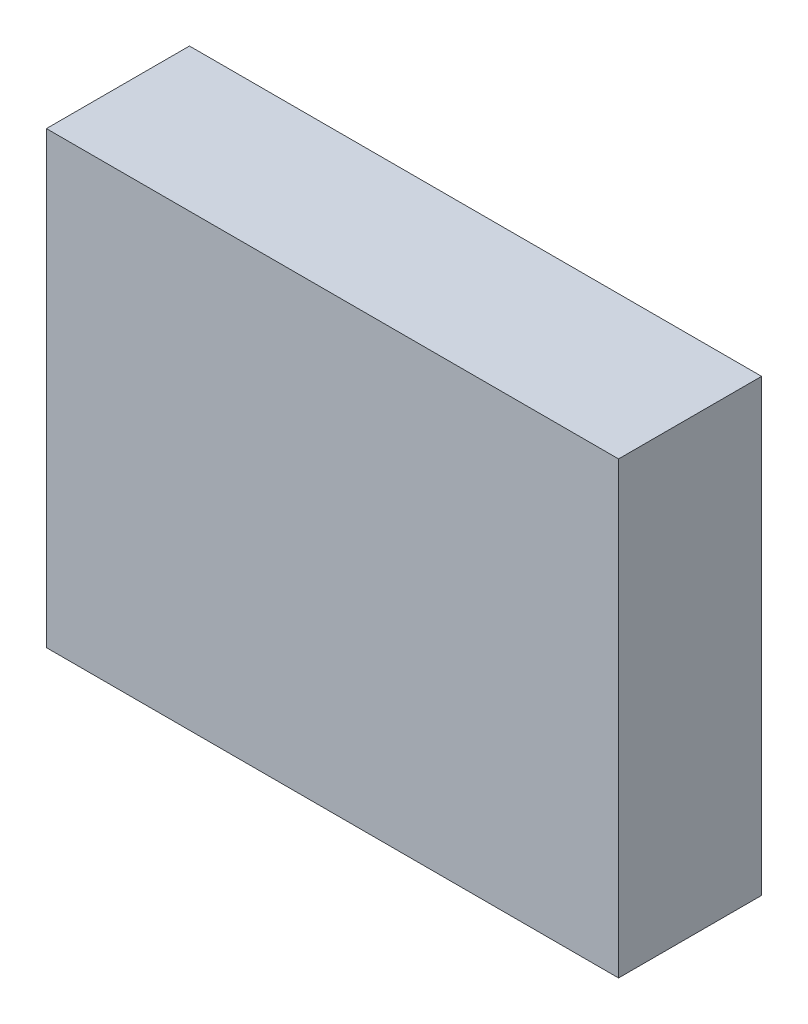
ISO-10303-21;
HEADER;
FILE_DESCRIPTION(('STEP AP214'),'2;1');
FILE_NAME('part.step','',(''),(''),'','','');
FILE_SCHEMA(('AUTOMOTIVE_DESIGN { 1 0 10303 214 1 1 1 1 }'));
ENDSEC;
DATA;
#1=APPLICATION_CONTEXT('core data for automotive mechanical design processes');
#2=APPLICATION_PROTOCOL_DEFINITION('international standard','automotive_design',2000,#1);
#3=PRODUCT_CONTEXT('',#1,'mechanical');
#4=PRODUCT('Part','Part','',(#3));
#5=PRODUCT_RELATED_PRODUCT_CATEGORY('part','',(#4));
#6=PRODUCT_DEFINITION_FORMATION('','',#4);
#7=PRODUCT_DEFINITION_CONTEXT('part definition',#1,'design');
#8=PRODUCT_DEFINITION('design','',#6,#7);
#9=PRODUCT_DEFINITION_SHAPE('','',#8);
#10=(LENGTH_UNIT() NAMED_UNIT(*) SI_UNIT(.MILLI.,.METRE.));
#11=(NAMED_UNIT(*) PLANE_ANGLE_UNIT() SI_UNIT($,.RADIAN.));
#12=(NAMED_UNIT(*) SI_UNIT($,.STERADIAN.) SOLID_ANGLE_UNIT());
#13=UNCERTAINTY_MEASURE_WITH_UNIT(LENGTH_MEASURE(1.E-05),#10,'distance_accuracy_value','');
#14=(GEOMETRIC_REPRESENTATION_CONTEXT(3) GLOBAL_UNCERTAINTY_ASSIGNED_CONTEXT((#13)) GLOBAL_UNIT_ASSIGNED_CONTEXT((#10,
#11,#12)) REPRESENTATION_CONTEXT('',''));
#15=CARTESIAN_POINT('',(0.,0.,0.));
#16=DIRECTION('',(0.,0.,1.));
#17=DIRECTION('',(1.,0.,0.));
#18=AXIS2_PLACEMENT_3D('',#15,#16,#17);
#19=CARTESIAN_POINT('',(0.,-6.,16.));
#20=DIRECTION('',(0.,0.,1.));
#21=DIRECTION('',(1.,0.,0.));
#22=AXIS2_PLACEMENT_3D('',#19,#20,#21);
#23=PLANE('',#22);
#24=DIRECTION('',(1.,0.,0.));
#25=VECTOR('',#24,1.);
#26=CARTESIAN_POINT('',(-7.,-11.5,16.));
#27=LINE('',#26,#25);
#28=CARTESIAN_POINT('',(-7.,-11.5,16.));
#29=VERTEX_POINT('',#28);
#30=CARTESIAN_POINT('',(7.,-11.5,16.));
#31=VERTEX_POINT('',#30);
#32=EDGE_CURVE('E79',#29,#31,#27,.T.);
#33=ORIENTED_EDGE('',*,*,#32,.T.);
#34=DIRECTION('',(0.,1.,0.));
#35=VECTOR('',#34,1.);
#36=CARTESIAN_POINT('',(7.,-11.5,16.));
#37=LINE('',#36,#35);
#38=CARTESIAN_POINT('',(7.,-0.5,16.));
#39=VERTEX_POINT('',#38);
#40=EDGE_CURVE('E96',#31,#39,#37,.T.);
#41=ORIENTED_EDGE('',*,*,#40,.T.);
#42=DIRECTION('',(-1.,0.,0.));
#43=VECTOR('',#42,1.);
#44=CARTESIAN_POINT('',(7.,-0.5,16.));
#45=LINE('',#44,#43);
#46=CARTESIAN_POINT('',(-7.,-0.5,16.));
#47=VERTEX_POINT('',#46);
#48=EDGE_CURVE('E73',#39,#47,#45,.T.);
#49=ORIENTED_EDGE('',*,*,#48,.T.);
#50=DIRECTION('',(0.,-1.,0.));
#51=VECTOR('',#50,1.);
#52=CARTESIAN_POINT('',(-7.,-0.5,16.));
#53=LINE('',#52,#51);
#54=EDGE_CURVE('E9',#47,#29,#53,.T.);
#55=ORIENTED_EDGE('',*,*,#54,.T.);
#56=EDGE_LOOP('',(#33,#41,#49,#55));
#57=FACE_BOUND('',#56,.T.);
#58=ADVANCED_FACE('F15',(#57),#23,.T.);
#59=CARTESIAN_POINT('',(0.,-6.,12.5));
#60=DIRECTION('',(0.,0.,1.));
#61=DIRECTION('',(1.,0.,0.));
#62=AXIS2_PLACEMENT_3D('',#59,#60,#61);
#63=PLANE('',#62);
#64=DIRECTION('',(0.,-1.,0.));
#65=VECTOR('',#64,1.);
#66=CARTESIAN_POINT('',(-7.,-0.5,12.5));
#67=LINE('',#66,#65);
#68=CARTESIAN_POINT('',(-7.,-0.5,12.5));
#69=VERTEX_POINT('',#68);
#70=CARTESIAN_POINT('',(-7.,-11.5,12.5));
#71=VERTEX_POINT('',#70);
#72=EDGE_CURVE('E18',#69,#71,#67,.T.);
#73=ORIENTED_EDGE('',*,*,#72,.F.);
#74=DIRECTION('',(-1.,0.,0.));
#75=VECTOR('',#74,1.);
#76=CARTESIAN_POINT('',(7.,-0.5,12.5));
#77=LINE('',#76,#75);
#78=CARTESIAN_POINT('',(7.,-0.5,12.5));
#79=VERTEX_POINT('',#78);
#80=EDGE_CURVE('E99',#79,#69,#77,.T.);
#81=ORIENTED_EDGE('',*,*,#80,.F.);
#82=DIRECTION('',(0.,1.,0.));
#83=VECTOR('',#82,1.);
#84=CARTESIAN_POINT('',(7.,-11.5,12.5));
#85=LINE('',#84,#83);
#86=CARTESIAN_POINT('',(7.,-11.5,12.5));
#87=VERTEX_POINT('',#86);
#88=EDGE_CURVE('E85',#87,#79,#85,.T.);
#89=ORIENTED_EDGE('',*,*,#88,.F.);
#90=DIRECTION('',(1.,0.,0.));
#91=VECTOR('',#90,1.);
#92=CARTESIAN_POINT('',(-7.,-11.5,12.5));
#93=LINE('',#92,#91);
#94=EDGE_CURVE('E77',#71,#87,#93,.T.);
#95=ORIENTED_EDGE('',*,*,#94,.F.);
#96=EDGE_LOOP('',(#73,#81,#89,#95));
#97=FACE_BOUND('',#96,.T.);
#98=ADVANCED_FACE('F82',(#97),#63,.F.);
#99=CARTESIAN_POINT('',(-7.,-0.5,12.5));
#100=DIRECTION('',(1.,0.,0.));
#101=DIRECTION('',(0.,1.,0.));
#102=AXIS2_PLACEMENT_3D('',#99,#100,#101);
#103=PLANE('',#102);
#104=ORIENTED_EDGE('',*,*,#72,.T.);
#105=DIRECTION('',(0.,0.,1.));
#106=VECTOR('',#105,1.);
#107=CARTESIAN_POINT('',(-7.,-11.5,12.5));
#108=LINE('',#107,#106);
#109=EDGE_CURVE('E70',#71,#29,#108,.T.);
#110=ORIENTED_EDGE('',*,*,#109,.T.);
#111=ORIENTED_EDGE('',*,*,#54,.F.);
#112=DIRECTION('',(0.,0.,1.));
#113=VECTOR('',#112,1.);
#114=CARTESIAN_POINT('',(-7.,-0.5,12.5));
#115=LINE('',#114,#113);
#116=EDGE_CURVE('E69',#69,#47,#115,.T.);
#117=ORIENTED_EDGE('',*,*,#116,.F.);
#118=EDGE_LOOP('',(#104,#110,#111,#117));
#119=FACE_BOUND('',#118,.T.);
#120=ADVANCED_FACE('F66',(#119),#103,.F.);
#121=CARTESIAN_POINT('',(7.,-0.5,12.5));
#122=DIRECTION('',(0.,-1.,0.));
#123=DIRECTION('',(0.,0.,-1.));
#124=AXIS2_PLACEMENT_3D('',#121,#122,#123);
#125=PLANE('',#124);
#126=ORIENTED_EDGE('',*,*,#80,.T.);
#127=ORIENTED_EDGE('',*,*,#116,.T.);
#128=ORIENTED_EDGE('',*,*,#48,.F.);
#129=DIRECTION('',(0.,0.,1.));
#130=VECTOR('',#129,1.);
#131=CARTESIAN_POINT('',(7.,-0.5,12.5));
#132=LINE('',#131,#130);
#133=EDGE_CURVE('E101',#79,#39,#132,.T.);
#134=ORIENTED_EDGE('',*,*,#133,.F.);
#135=EDGE_LOOP('',(#126,#127,#128,#134));
#136=FACE_BOUND('',#135,.T.);
#137=ADVANCED_FACE('F113',(#136),#125,.F.);
#138=CARTESIAN_POINT('',(7.,-11.5,12.5));
#139=DIRECTION('',(-1.,0.,0.));
#140=DIRECTION('',(0.,0.,1.));
#141=AXIS2_PLACEMENT_3D('',#138,#139,#140);
#142=PLANE('',#141);
#143=ORIENTED_EDGE('',*,*,#88,.T.);
#144=ORIENTED_EDGE('',*,*,#133,.T.);
#145=ORIENTED_EDGE('',*,*,#40,.F.);
#146=DIRECTION('',(0.,0.,1.));
#147=VECTOR('',#146,1.);
#148=CARTESIAN_POINT('',(7.,-11.5,12.5));
#149=LINE('',#148,#147);
#150=EDGE_CURVE('E86',#87,#31,#149,.T.);
#151=ORIENTED_EDGE('',*,*,#150,.F.);
#152=EDGE_LOOP('',(#143,#144,#145,#151));
#153=FACE_BOUND('',#152,.T.);
#154=ADVANCED_FACE('F117',(#153),#142,.F.);
#155=CARTESIAN_POINT('',(-7.,-11.5,12.5));
#156=DIRECTION('',(0.,1.,0.));
#157=DIRECTION('',(1.,0.,0.));
#158=AXIS2_PLACEMENT_3D('',#155,#156,#157);
#159=PLANE('',#158);
#160=ORIENTED_EDGE('',*,*,#94,.T.);
#161=ORIENTED_EDGE('',*,*,#150,.T.);
#162=ORIENTED_EDGE('',*,*,#32,.F.);
#163=ORIENTED_EDGE('',*,*,#109,.F.);
#164=EDGE_LOOP('',(#160,#161,#162,#163));
#165=FACE_BOUND('',#164,.T.);
#166=ADVANCED_FACE('F76',(#165),#159,.F.);
#167=CLOSED_SHELL('',(#58,#98,#120,#137,#154,#166));
#168=MANIFOLD_SOLID_BREP('B1',#167);
#169=ADVANCED_BREP_SHAPE_REPRESENTATION('',(#18,#168),#14);
#170=SHAPE_DEFINITION_REPRESENTATION(#9,#169);
ENDSEC;
END-ISO-10303-21;
